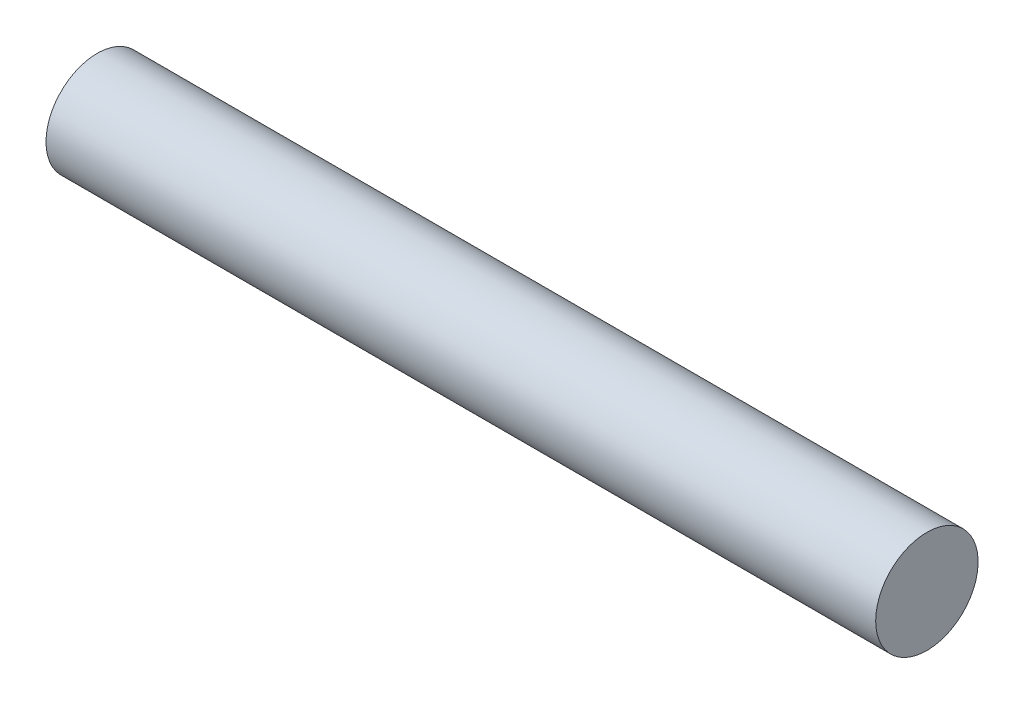
ISO-10303-21;
HEADER;
FILE_DESCRIPTION(('STEP AP214'),'2;1');
FILE_NAME('part.step','',(''),(''),'','','');
FILE_SCHEMA(('AUTOMOTIVE_DESIGN { 1 0 10303 214 1 1 1 1 }'));
ENDSEC;
DATA;
#1=APPLICATION_CONTEXT('core data for automotive mechanical design processes');
#2=APPLICATION_PROTOCOL_DEFINITION('international standard','automotive_design',2000,#1);
#3=PRODUCT_CONTEXT('',#1,'mechanical');
#4=PRODUCT('Part','Part','',(#3));
#5=PRODUCT_RELATED_PRODUCT_CATEGORY('part','',(#4));
#6=PRODUCT_DEFINITION_FORMATION('','',#4);
#7=PRODUCT_DEFINITION_CONTEXT('part definition',#1,'design');
#8=PRODUCT_DEFINITION('design','',#6,#7);
#9=PRODUCT_DEFINITION_SHAPE('','',#8);
#10=(LENGTH_UNIT() NAMED_UNIT(*) SI_UNIT(.MILLI.,.METRE.));
#11=(NAMED_UNIT(*) PLANE_ANGLE_UNIT() SI_UNIT($,.RADIAN.));
#12=(NAMED_UNIT(*) SI_UNIT($,.STERADIAN.) SOLID_ANGLE_UNIT());
#13=UNCERTAINTY_MEASURE_WITH_UNIT(LENGTH_MEASURE(1.E-05),#10,'distance_accuracy_value','');
#14=(GEOMETRIC_REPRESENTATION_CONTEXT(3) GLOBAL_UNCERTAINTY_ASSIGNED_CONTEXT((#13)) GLOBAL_UNIT_ASSIGNED_CONTEXT((#10,
#11,#12)) REPRESENTATION_CONTEXT('',''));
#15=CARTESIAN_POINT('',(0.,0.,0.));
#16=DIRECTION('',(0.,0.,1.));
#17=DIRECTION('',(1.,0.,0.));
#18=AXIS2_PLACEMENT_3D('',#15,#16,#17);
#19=CARTESIAN_POINT('',(-81.,4.999999906,0.));
#20=DIRECTION('',(1.,0.,0.));
#21=DIRECTION('',(0.,0.,-1.));
#22=AXIS2_PLACEMENT_3D('',#19,#20,#21);
#23=PLANE('',#22);
#24=CARTESIAN_POINT('',(-81.,-4.999999906,0.));
#25=DIRECTION('',(-1.,0.,0.));
#26=DIRECTION('',(0.,0.,1.));
#27=AXIS2_PLACEMENT_3D('',#24,#25,#26);
#28=CIRCLE('',#27,9.999999812);
#29=CARTESIAN_POINT('',(-81.,-4.999999906,9.999999812));
#30=VERTEX_POINT('',#29);
#31=EDGE_CURVE('E44',#30,#30,#28,.T.);
#32=ORIENTED_EDGE('',*,*,#31,.T.);
#33=EDGE_LOOP('',(#32));
#34=FACE_BOUND('',#33,.T.);
#35=ADVANCED_FACE('F37',(#34),#23,.F.);
#36=CARTESIAN_POINT('',(81.000000052,4.999999906,0.));
#37=DIRECTION('',(-1.,0.,0.));
#38=DIRECTION('',(0.,0.,1.));
#39=AXIS2_PLACEMENT_3D('',#36,#37,#38);
#40=PLANE('',#39);
#41=CARTESIAN_POINT('',(81.000000052,-4.999999906,0.));
#42=DIRECTION('',(-1.,0.,0.));
#43=DIRECTION('',(0.,0.,1.));
#44=AXIS2_PLACEMENT_3D('',#41,#42,#43);
#45=CIRCLE('',#44,9.999999812);
#46=CARTESIAN_POINT('',(81.000000052,-4.999999906,9.999999812));
#47=VERTEX_POINT('',#46);
#48=EDGE_CURVE('E10',#47,#47,#45,.T.);
#49=ORIENTED_EDGE('',*,*,#48,.F.);
#50=EDGE_LOOP('',(#49));
#51=FACE_BOUND('',#50,.T.);
#52=ADVANCED_FACE('F54',(#51),#40,.F.);
#53=CARTESIAN_POINT('',(-81.,-4.999999906,0.));
#54=DIRECTION('',(-1.,0.,0.));
#55=DIRECTION('',(0.,0.,1.));
#56=AXIS2_PLACEMENT_3D('',#53,#54,#55);
#57=CYLINDRICAL_SURFACE('',#56,9.999999812);
#58=ORIENTED_EDGE('',*,*,#31,.F.);
#59=EDGE_LOOP('',(#58));
#60=FACE_BOUND('',#59,.T.);
#61=ORIENTED_EDGE('',*,*,#48,.T.);
#62=EDGE_LOOP('',(#61));
#63=FACE_BOUND('',#62,.T.);
#64=ADVANCED_FACE('F52',(#60,#63),#57,.T.);
#65=CLOSED_SHELL('',(#35,#52,#64));
#66=MANIFOLD_SOLID_BREP('B2',#65);
#67=ADVANCED_BREP_SHAPE_REPRESENTATION('',(#18,#66),#14);
#68=SHAPE_DEFINITION_REPRESENTATION(#9,#67);
ENDSEC;
END-ISO-10303-21;
